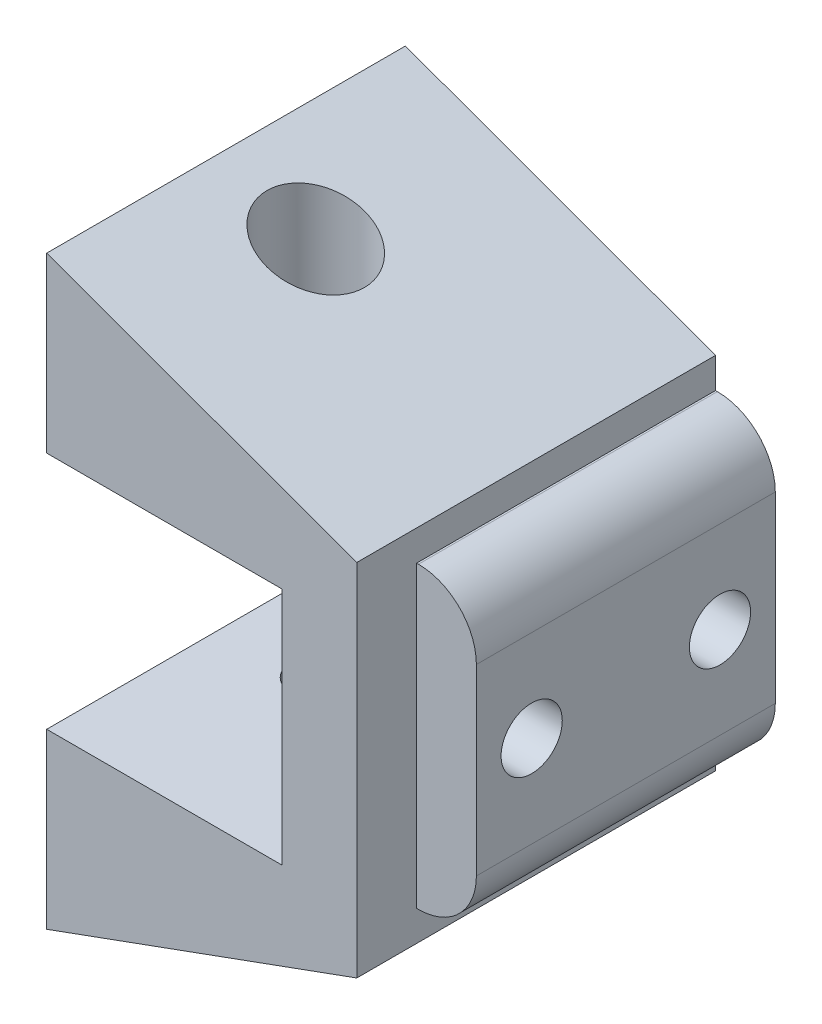
ISO-10303-21;
HEADER;
FILE_DESCRIPTION(('STEP AP214'),'2;1');
FILE_NAME('part.step','',(''),(''),'','','');
FILE_SCHEMA(('AUTOMOTIVE_DESIGN { 1 0 10303 214 1 1 1 1 }'));
ENDSEC;
DATA;
#1=APPLICATION_CONTEXT('core data for automotive mechanical design processes');
#2=APPLICATION_PROTOCOL_DEFINITION('international standard','automotive_design',2000,#1);
#3=PRODUCT_CONTEXT('',#1,'mechanical');
#4=PRODUCT('Part','Part','',(#3));
#5=PRODUCT_RELATED_PRODUCT_CATEGORY('part','',(#4));
#6=PRODUCT_DEFINITION_FORMATION('','',#4);
#7=PRODUCT_DEFINITION_CONTEXT('part definition',#1,'design');
#8=PRODUCT_DEFINITION('design','',#6,#7);
#9=PRODUCT_DEFINITION_SHAPE('','',#8);
#10=(LENGTH_UNIT() NAMED_UNIT(*) SI_UNIT(.MILLI.,.METRE.));
#11=(NAMED_UNIT(*) PLANE_ANGLE_UNIT() SI_UNIT($,.RADIAN.));
#12=(NAMED_UNIT(*) SI_UNIT($,.STERADIAN.) SOLID_ANGLE_UNIT());
#13=UNCERTAINTY_MEASURE_WITH_UNIT(LENGTH_MEASURE(1.E-05),#10,'distance_accuracy_value','');
#14=(GEOMETRIC_REPRESENTATION_CONTEXT(3) GLOBAL_UNCERTAINTY_ASSIGNED_CONTEXT((#13)) GLOBAL_UNIT_ASSIGNED_CONTEXT((#10,
#11,#12)) REPRESENTATION_CONTEXT('',''));
#15=CARTESIAN_POINT('',(0.,0.,0.));
#16=DIRECTION('',(0.,0.,1.));
#17=DIRECTION('',(1.,0.,0.));
#18=AXIS2_PLACEMENT_3D('',#15,#16,#17);
#19=CARTESIAN_POINT('',(0.,0.,0.));
#20=DIRECTION('',(1.,0.,0.));
#21=DIRECTION('',(0.,0.,-1.));
#22=AXIS2_PLACEMENT_3D('',#19,#20,#21);
#23=PLANE('',#22);
#24=CARTESIAN_POINT('',(0.,0.,4.701));
#25=DIRECTION('',(1.,0.,0.));
#26=DIRECTION('',(0.,0.,-1.));
#27=AXIS2_PLACEMENT_3D('',#24,#25,#26);
#28=CIRCLE('',#27,2.6);
#29=CARTESIAN_POINT('',(0.,0.,2.101));
#30=VERTEX_POINT('',#29);
#31=EDGE_CURVE('E54',#30,#30,#28,.T.);
#32=ORIENTED_EDGE('',*,*,#31,.T.);
#33=EDGE_LOOP('',(#32));
#34=FACE_BOUND('',#33,.T.);
#35=CARTESIAN_POINT('',(0.,0.,20.701));
#36=DIRECTION('',(1.,0.,0.));
#37=DIRECTION('',(0.,0.,-1.));
#38=AXIS2_PLACEMENT_3D('',#35,#36,#37);
#39=CIRCLE('',#38,2.6);
#40=CARTESIAN_POINT('',(0.,0.,18.101));
#41=VERTEX_POINT('',#40);
#42=EDGE_CURVE('E333',#41,#41,#39,.T.);
#43=ORIENTED_EDGE('',*,*,#42,.T.);
#44=EDGE_LOOP('',(#43));
#45=FACE_BOUND('',#44,.T.);
#46=DIRECTION('',(0.,0.,1.));
#47=VECTOR('',#46,1.);
#48=CARTESIAN_POINT('',(0.,10.16,30.48));
#49=LINE('',#48,#47);
#50=CARTESIAN_POINT('',(0.,10.16,0.));
#51=VERTEX_POINT('',#50);
#52=CARTESIAN_POINT('',(0.,10.16,30.48));
#53=VERTEX_POINT('',#52);
#54=EDGE_CURVE('E218',#51,#53,#49,.T.);
#55=ORIENTED_EDGE('',*,*,#54,.F.);
#56=DIRECTION('',(0.,1.,0.));
#57=VECTOR('',#56,1.);
#58=CARTESIAN_POINT('',(0.,-25.4,0.));
#59=LINE('',#58,#57);
#60=CARTESIAN_POINT('',(0.,-10.16,0.));
#61=VERTEX_POINT('',#60);
#62=EDGE_CURVE('E237',#61,#51,#59,.T.);
#63=ORIENTED_EDGE('',*,*,#62,.F.);
#64=DIRECTION('',(0.,0.,-1.));
#65=VECTOR('',#64,1.);
#66=CARTESIAN_POINT('',(0.,-10.16,30.48));
#67=LINE('',#66,#65);
#68=CARTESIAN_POINT('',(0.,-10.16,30.48));
#69=VERTEX_POINT('',#68);
#70=EDGE_CURVE('E233',#69,#61,#67,.T.);
#71=ORIENTED_EDGE('',*,*,#70,.F.);
#72=DIRECTION('',(0.,-1.,0.));
#73=VECTOR('',#72,1.);
#74=CARTESIAN_POINT('',(0.,-25.4,30.48));
#75=LINE('',#74,#73);
#76=EDGE_CURVE('E275',#53,#69,#75,.T.);
#77=ORIENTED_EDGE('',*,*,#76,.F.);
#78=EDGE_LOOP('',(#55,#63,#71,#77));
#79=FACE_BOUND('',#78,.T.);
#80=ADVANCED_FACE('F51',(#34,#45,#79),#23,.F.);
#81=CARTESIAN_POINT('',(6.35,-25.4,0.));
#82=DIRECTION('',(0.,0.,1.));
#83=DIRECTION('',(1.,0.,0.));
#84=AXIS2_PLACEMENT_3D('',#81,#82,#83);
#85=PLANE('',#84);
#86=DIRECTION('',(-1.,0.,0.));
#87=VECTOR('',#86,1.);
#88=CARTESIAN_POINT('',(11.43,12.7,0.));
#89=LINE('',#88,#87);
#90=CARTESIAN_POINT('',(6.51,12.7,0.));
#91=VERTEX_POINT('',#90);
#92=CARTESIAN_POINT('',(6.35,12.7,0.));
#93=VERTEX_POINT('',#92);
#94=EDGE_CURVE('E161',#91,#93,#89,.T.);
#95=ORIENTED_EDGE('',*,*,#94,.F.);
#96=CARTESIAN_POINT('',(6.51,7.78,0.));
#97=DIRECTION('',(0.,0.,1.));
#98=DIRECTION('',(1.,0.,0.));
#99=AXIS2_PLACEMENT_3D('',#96,#97,#98);
#100=CIRCLE('',#99,4.92);
#101=CARTESIAN_POINT('',(11.43,7.78,0.));
#102=VERTEX_POINT('',#101);
#103=EDGE_CURVE('E63',#91,#102,#100,.F.);
#104=ORIENTED_EDGE('',*,*,#103,.T.);
#105=DIRECTION('',(0.,1.,0.));
#106=VECTOR('',#105,1.);
#107=CARTESIAN_POINT('',(11.43,-12.7,0.));
#108=LINE('',#107,#106);
#109=CARTESIAN_POINT('',(11.43,-7.78,0.));
#110=VERTEX_POINT('',#109);
#111=EDGE_CURVE('E180',#110,#102,#108,.T.);
#112=ORIENTED_EDGE('',*,*,#111,.F.);
#113=CARTESIAN_POINT('',(6.51,-7.78,0.));
#114=DIRECTION('',(0.,0.,1.));
#115=DIRECTION('',(1.,0.,0.));
#116=AXIS2_PLACEMENT_3D('',#113,#114,#115);
#117=CIRCLE('',#116,4.92);
#118=CARTESIAN_POINT('',(6.51,-12.7,0.));
#119=VERTEX_POINT('',#118);
#120=EDGE_CURVE('E66',#110,#119,#117,.F.);
#121=ORIENTED_EDGE('',*,*,#120,.T.);
#122=DIRECTION('',(-1.,0.,0.));
#123=VECTOR('',#122,1.);
#124=CARTESIAN_POINT('',(11.43,-12.7,0.));
#125=LINE('',#124,#123);
#126=CARTESIAN_POINT('',(6.35,-12.7,0.));
#127=VERTEX_POINT('',#126);
#128=EDGE_CURVE('E194',#119,#127,#125,.T.);
#129=ORIENTED_EDGE('',*,*,#128,.T.);
#130=DIRECTION('',(0.,1.,0.));
#131=VECTOR('',#130,1.);
#132=CARTESIAN_POINT('',(6.35,-25.4,0.));
#133=LINE('',#132,#131);
#134=CARTESIAN_POINT('',(6.35,-15.2889068920846,0.));
#135=VERTEX_POINT('',#134);
#136=EDGE_CURVE('E256',#135,#127,#133,.T.);
#137=ORIENTED_EDGE('',*,*,#136,.F.);
#138=DIRECTION('',(-0.939692620785906,-0.342020143325676,0.));
#139=VECTOR('',#138,1.);
#140=CARTESIAN_POINT('',(6.35,-15.2889068920846,0.));
#141=LINE('',#140,#139);
#142=CARTESIAN_POINT('',(-20.,-24.8795225649993,0.));
#143=VERTEX_POINT('',#142);
#144=EDGE_CURVE('E296',#135,#143,#141,.T.);
#145=ORIENTED_EDGE('',*,*,#144,.T.);
#146=DIRECTION('',(0.,-1.,0.));
#147=VECTOR('',#146,1.);
#148=CARTESIAN_POINT('',(-20.,-25.4,0.));
#149=LINE('',#148,#147);
#150=CARTESIAN_POINT('',(-20.,-10.16,0.));
#151=VERTEX_POINT('',#150);
#152=EDGE_CURVE('E250',#151,#143,#149,.T.);
#153=ORIENTED_EDGE('',*,*,#152,.F.);
#154=DIRECTION('',(1.,0.,0.));
#155=VECTOR('',#154,1.);
#156=CARTESIAN_POINT('',(-20.,-10.16,0.));
#157=LINE('',#156,#155);
#158=EDGE_CURVE('E243',#151,#61,#157,.T.);
#159=ORIENTED_EDGE('',*,*,#158,.T.);
#160=ORIENTED_EDGE('',*,*,#62,.T.);
#161=DIRECTION('',(1.,0.,0.));
#162=VECTOR('',#161,1.);
#163=CARTESIAN_POINT('',(-20.,10.16,0.));
#164=LINE('',#163,#162);
#165=CARTESIAN_POINT('',(-20.,10.16,0.));
#166=VERTEX_POINT('',#165);
#167=EDGE_CURVE('E232',#166,#51,#164,.T.);
#168=ORIENTED_EDGE('',*,*,#167,.F.);
#169=DIRECTION('',(0.,-1.,0.));
#170=VECTOR('',#169,1.);
#171=CARTESIAN_POINT('',(-20.,25.4,0.));
#172=LINE('',#171,#170);
#173=CARTESIAN_POINT('',(-20.,24.8795225649993,0.));
#174=VERTEX_POINT('',#173);
#175=EDGE_CURVE('E217',#174,#166,#172,.T.);
#176=ORIENTED_EDGE('',*,*,#175,.F.);
#177=DIRECTION('',(0.939692620785906,-0.342020143325676,0.));
#178=VECTOR('',#177,1.);
#179=CARTESIAN_POINT('',(6.35,15.2889068920846,0.));
#180=LINE('',#179,#178);
#181=CARTESIAN_POINT('',(6.35,15.2889068920846,0.));
#182=VERTEX_POINT('',#181);
#183=EDGE_CURVE('E301',#174,#182,#180,.T.);
#184=ORIENTED_EDGE('',*,*,#183,.T.);
#185=EDGE_CURVE('E261',#93,#182,#133,.T.);
#186=ORIENTED_EDGE('',*,*,#185,.F.);
#187=EDGE_LOOP('',(#95,#104,#112,#121,#129,#137,#145,#153,#159,#160,#168,#176,#184,#186));
#188=FACE_BOUND('',#187,.T.);
#189=ADVANCED_FACE('F363',(#188),#85,.F.);
#190=CARTESIAN_POINT('',(6.35,-25.4,30.48));
#191=DIRECTION('',(0.,0.,-1.));
#192=DIRECTION('',(-1.,0.,0.));
#193=AXIS2_PLACEMENT_3D('',#190,#191,#192);
#194=PLANE('',#193);
#195=DIRECTION('',(0.,-1.,0.));
#196=VECTOR('',#195,1.);
#197=CARTESIAN_POINT('',(6.35,-25.4,30.48));
#198=LINE('',#197,#196);
#199=CARTESIAN_POINT('',(6.35,15.2889068920846,30.48));
#200=VERTEX_POINT('',#199);
#201=CARTESIAN_POINT('',(6.35,-15.2889068920846,30.48));
#202=VERTEX_POINT('',#201);
#203=EDGE_CURVE('E264',#200,#202,#198,.T.);
#204=ORIENTED_EDGE('',*,*,#203,.F.);
#205=DIRECTION('',(-0.939692620785906,0.342020143325676,0.));
#206=VECTOR('',#205,1.);
#207=CARTESIAN_POINT('',(6.35,15.2889068920846,30.48));
#208=LINE('',#207,#206);
#209=CARTESIAN_POINT('',(-20.,24.8795225649993,30.48));
#210=VERTEX_POINT('',#209);
#211=EDGE_CURVE('E292',#200,#210,#208,.T.);
#212=ORIENTED_EDGE('',*,*,#211,.T.);
#213=DIRECTION('',(0.,1.,0.));
#214=VECTOR('',#213,1.);
#215=CARTESIAN_POINT('',(-20.,25.4,30.48));
#216=LINE('',#215,#214);
#217=CARTESIAN_POINT('',(-20.,10.16,30.48));
#218=VERTEX_POINT('',#217);
#219=EDGE_CURVE('E222',#218,#210,#216,.T.);
#220=ORIENTED_EDGE('',*,*,#219,.F.);
#221=DIRECTION('',(1.,0.,0.));
#222=VECTOR('',#221,1.);
#223=CARTESIAN_POINT('',(-20.,10.16,30.48));
#224=LINE('',#223,#222);
#225=EDGE_CURVE('E227',#218,#53,#224,.T.);
#226=ORIENTED_EDGE('',*,*,#225,.T.);
#227=ORIENTED_EDGE('',*,*,#76,.T.);
#228=DIRECTION('',(1.,0.,0.));
#229=VECTOR('',#228,1.);
#230=CARTESIAN_POINT('',(-20.,-10.16,30.48));
#231=LINE('',#230,#229);
#232=CARTESIAN_POINT('',(-20.,-10.16,30.48));
#233=VERTEX_POINT('',#232);
#234=EDGE_CURVE('E215',#233,#69,#231,.T.);
#235=ORIENTED_EDGE('',*,*,#234,.F.);
#236=DIRECTION('',(0.,1.,0.));
#237=VECTOR('',#236,1.);
#238=CARTESIAN_POINT('',(-20.,-25.4,30.48));
#239=LINE('',#238,#237);
#240=CARTESIAN_POINT('',(-20.,-24.8795225649993,30.48));
#241=VERTEX_POINT('',#240);
#242=EDGE_CURVE('E252',#241,#233,#239,.T.);
#243=ORIENTED_EDGE('',*,*,#242,.F.);
#244=DIRECTION('',(0.939692620785906,0.342020143325676,0.));
#245=VECTOR('',#244,1.);
#246=CARTESIAN_POINT('',(6.35,-15.2889068920846,30.48));
#247=LINE('',#246,#245);
#248=EDGE_CURVE('E290',#241,#202,#247,.T.);
#249=ORIENTED_EDGE('',*,*,#248,.T.);
#250=EDGE_LOOP('',(#204,#212,#220,#226,#227,#235,#243,#249));
#251=FACE_BOUND('',#250,.T.);
#252=ADVANCED_FACE('F366',(#251),#194,.F.);
#253=CARTESIAN_POINT('',(6.35,0.,0.));
#254=DIRECTION('',(1.,0.,0.));
#255=DIRECTION('',(0.,0.,-1.));
#256=AXIS2_PLACEMENT_3D('',#253,#254,#255);
#257=PLANE('',#256);
#258=ORIENTED_EDGE('',*,*,#185,.T.);
#259=DIRECTION('',(0.,0.,1.));
#260=VECTOR('',#259,1.);
#261=CARTESIAN_POINT('',(6.35,15.2889068920846,30.48));
#262=LINE('',#261,#260);
#263=EDGE_CURVE('E283',#182,#200,#262,.T.);
#264=ORIENTED_EDGE('',*,*,#263,.T.);
#265=ORIENTED_EDGE('',*,*,#203,.T.);
#266=DIRECTION('',(0.,0.,-1.));
#267=VECTOR('',#266,1.);
#268=CARTESIAN_POINT('',(6.35,-15.2889068920846,0.));
#269=LINE('',#268,#267);
#270=EDGE_CURVE('E267',#202,#135,#269,.T.);
#271=ORIENTED_EDGE('',*,*,#270,.T.);
#272=ORIENTED_EDGE('',*,*,#136,.T.);
#273=DIRECTION('',(0.,0.,-1.));
#274=VECTOR('',#273,1.);
#275=CARTESIAN_POINT('',(6.35,-12.7,0.));
#276=LINE('',#275,#274);
#277=CARTESIAN_POINT('',(6.35,-12.7,25.4));
#278=VERTEX_POINT('',#277);
#279=EDGE_CURVE('E174',#278,#127,#276,.T.);
#280=ORIENTED_EDGE('',*,*,#279,.F.);
#281=DIRECTION('',(0.,-1.,0.));
#282=VECTOR('',#281,1.);
#283=CARTESIAN_POINT('',(6.35,-12.7,25.4));
#284=LINE('',#283,#282);
#285=CARTESIAN_POINT('',(6.35,12.7,25.4));
#286=VERTEX_POINT('',#285);
#287=EDGE_CURVE('E160',#286,#278,#284,.T.);
#288=ORIENTED_EDGE('',*,*,#287,.F.);
#289=DIRECTION('',(0.,0.,1.));
#290=VECTOR('',#289,1.);
#291=CARTESIAN_POINT('',(6.35,12.7,0.));
#292=LINE('',#291,#290);
#293=EDGE_CURVE('E171',#93,#286,#292,.T.);
#294=ORIENTED_EDGE('',*,*,#293,.F.);
#295=EDGE_LOOP('',(#258,#264,#265,#271,#272,#280,#288,#294));
#296=FACE_BOUND('',#295,.T.);
#297=ADVANCED_FACE('F167',(#296),#257,.T.);
#298=CARTESIAN_POINT('',(-20.,-10.16,30.48));
#299=DIRECTION('',(0.,-1.,0.));
#300=DIRECTION('',(0.,0.,-1.));
#301=AXIS2_PLACEMENT_3D('',#298,#299,#300);
#302=PLANE('',#301);
#303=CARTESIAN_POINT('',(-12.38,-10.16,15.24));
#304=DIRECTION('',(0.,-1.,0.));
#305=DIRECTION('',(0.,0.,-1.));
#306=AXIS2_PLACEMENT_3D('',#303,#304,#305);
#307=CIRCLE('',#306,2.135);
#308=CARTESIAN_POINT('',(-12.38,-10.16,13.105));
#309=VERTEX_POINT('',#308);
#310=EDGE_CURVE('E196',#309,#309,#307,.T.);
#311=ORIENTED_EDGE('',*,*,#310,.T.);
#312=EDGE_LOOP('',(#311));
#313=FACE_BOUND('',#312,.T.);
#314=ORIENTED_EDGE('',*,*,#70,.T.);
#315=ORIENTED_EDGE('',*,*,#158,.F.);
#316=DIRECTION('',(0.,0.,-1.));
#317=VECTOR('',#316,1.);
#318=CARTESIAN_POINT('',(-20.,-10.16,30.48));
#319=LINE('',#318,#317);
#320=EDGE_CURVE('E253',#233,#151,#319,.T.);
#321=ORIENTED_EDGE('',*,*,#320,.F.);
#322=ORIENTED_EDGE('',*,*,#234,.T.);
#323=EDGE_LOOP('',(#314,#315,#321,#322));
#324=FACE_BOUND('',#323,.T.);
#325=ADVANCED_FACE('F454',(#313,#324),#302,.F.);
#326=CARTESIAN_POINT('',(-20.,0.,0.));
#327=DIRECTION('',(1.,0.,0.));
#328=DIRECTION('',(0.,0.,-1.));
#329=AXIS2_PLACEMENT_3D('',#326,#327,#328);
#330=PLANE('',#329);
#331=ORIENTED_EDGE('',*,*,#152,.T.);
#332=DIRECTION('',(0.,0.,1.));
#333=VECTOR('',#332,1.);
#334=CARTESIAN_POINT('',(-20.,-24.8795225649993,0.));
#335=LINE('',#334,#333);
#336=EDGE_CURVE('E302',#143,#241,#335,.T.);
#337=ORIENTED_EDGE('',*,*,#336,.T.);
#338=ORIENTED_EDGE('',*,*,#242,.T.);
#339=ORIENTED_EDGE('',*,*,#320,.T.);
#340=EDGE_LOOP('',(#331,#337,#338,#339));
#341=FACE_BOUND('',#340,.T.);
#342=ADVANCED_FACE('F448',(#341),#330,.F.);
#343=CARTESIAN_POINT('',(-20.,10.16,30.48));
#344=DIRECTION('',(0.,1.,0.));
#345=DIRECTION('',(0.,0.,1.));
#346=AXIS2_PLACEMENT_3D('',#343,#344,#345);
#347=PLANE('',#346);
#348=CARTESIAN_POINT('',(-12.38,10.16,15.24));
#349=DIRECTION('',(0.,1.,0.));
#350=DIRECTION('',(0.,0.,1.));
#351=AXIS2_PLACEMENT_3D('',#348,#349,#350);
#352=CIRCLE('',#351,2.35);
#353=CARTESIAN_POINT('',(-12.38,10.16,17.59));
#354=VERTEX_POINT('',#353);
#355=EDGE_CURVE('E209',#354,#354,#352,.T.);
#356=ORIENTED_EDGE('',*,*,#355,.T.);
#357=EDGE_LOOP('',(#356));
#358=FACE_BOUND('',#357,.T.);
#359=ORIENTED_EDGE('',*,*,#54,.T.);
#360=ORIENTED_EDGE('',*,*,#225,.F.);
#361=DIRECTION('',(0.,0.,1.));
#362=VECTOR('',#361,1.);
#363=CARTESIAN_POINT('',(-20.,10.16,30.48));
#364=LINE('',#363,#362);
#365=EDGE_CURVE('E216',#166,#218,#364,.T.);
#366=ORIENTED_EDGE('',*,*,#365,.F.);
#367=ORIENTED_EDGE('',*,*,#167,.T.);
#368=EDGE_LOOP('',(#359,#360,#366,#367));
#369=FACE_BOUND('',#368,.T.);
#370=ADVANCED_FACE('F447',(#358,#369),#347,.F.);
#371=CARTESIAN_POINT('',(-20.,0.,0.));
#372=DIRECTION('',(-1.,0.,0.));
#373=DIRECTION('',(0.,0.,1.));
#374=AXIS2_PLACEMENT_3D('',#371,#372,#373);
#375=PLANE('',#374);
#376=ORIENTED_EDGE('',*,*,#219,.T.);
#377=DIRECTION('',(0.,0.,-1.));
#378=VECTOR('',#377,1.);
#379=CARTESIAN_POINT('',(-20.,24.8795225649993,0.));
#380=LINE('',#379,#378);
#381=EDGE_CURVE('E294',#210,#174,#380,.T.);
#382=ORIENTED_EDGE('',*,*,#381,.T.);
#383=ORIENTED_EDGE('',*,*,#175,.T.);
#384=ORIENTED_EDGE('',*,*,#365,.T.);
#385=EDGE_LOOP('',(#376,#382,#383,#384));
#386=FACE_BOUND('',#385,.T.);
#387=ADVANCED_FACE('F445',(#386),#375,.T.);
#388=CARTESIAN_POINT('',(-12.38,14.732,15.24));
#389=DIRECTION('',(0.,1.,0.));
#390=DIRECTION('',(0.,0.,1.));
#391=AXIS2_PLACEMENT_3D('',#388,#389,#390);
#392=CYLINDRICAL_SURFACE('',#391,4.135);
#393=CARTESIAN_POINT('',(-12.38,14.732,15.24));
#394=DIRECTION('',(0.,1.,0.));
#395=DIRECTION('',(0.,0.,1.));
#396=AXIS2_PLACEMENT_3D('',#393,#394,#395);
#397=CIRCLE('',#396,4.135);
#398=CARTESIAN_POINT('',(-12.38,14.732,19.375));
#399=VERTEX_POINT('',#398);
#400=EDGE_CURVE('E208',#399,#399,#397,.T.);
#401=ORIENTED_EDGE('',*,*,#400,.F.);
#402=EDGE_LOOP('',(#401));
#403=FACE_BOUND('',#402,.T.);
#404=CARTESIAN_POINT('',(-12.38,22.1060693798907,15.24));
#405=DIRECTION('',(0.342020143325676,0.939692620785906,0.));
#406=DIRECTION('',(-0.939692620785906,0.342020143325676,0.));
#407=AXIS2_PLACEMENT_3D('',#404,#405,#406);
#408=ELLIPSE('',#407,4.4003750891879,4.135);
#409=CARTESIAN_POINT('',(-16.515,23.6110862985815,15.24));
#410=VERTEX_POINT('',#409);
#411=EDGE_CURVE('E211',#410,#410,#408,.T.);
#412=ORIENTED_EDGE('',*,*,#411,.T.);
#413=EDGE_LOOP('',(#412));
#414=FACE_BOUND('',#413,.T.);
#415=ADVANCED_FACE('F438',(#403,#414),#392,.F.);
#416=CARTESIAN_POINT('',(-12.38,14.732,15.24));
#417=DIRECTION('',(0.,1.,0.));
#418=DIRECTION('',(0.,0.,1.));
#419=AXIS2_PLACEMENT_3D('',#416,#417,#418);
#420=PLANE('',#419);
#421=CARTESIAN_POINT('',(-12.38,14.732,15.24));
#422=DIRECTION('',(0.,1.,0.));
#423=DIRECTION('',(0.,0.,1.));
#424=AXIS2_PLACEMENT_3D('',#421,#422,#423);
#425=CIRCLE('',#424,2.35);
#426=CARTESIAN_POINT('',(-12.38,14.732,17.59));
#427=VERTEX_POINT('',#426);
#428=EDGE_CURVE('E205',#427,#427,#425,.T.);
#429=ORIENTED_EDGE('',*,*,#428,.F.);
#430=EDGE_LOOP('',(#429));
#431=FACE_BOUND('',#430,.T.);
#432=ORIENTED_EDGE('',*,*,#400,.T.);
#433=EDGE_LOOP('',(#432));
#434=FACE_BOUND('',#433,.T.);
#435=ADVANCED_FACE('F432',(#431,#434),#420,.T.);
#436=CARTESIAN_POINT('',(-12.38,6.73199999999998,15.24));
#437=DIRECTION('',(0.,1.,0.));
#438=DIRECTION('',(0.,0.,1.));
#439=AXIS2_PLACEMENT_3D('',#436,#437,#438);
#440=CYLINDRICAL_SURFACE('',#439,2.35);
#441=ORIENTED_EDGE('',*,*,#428,.T.);
#442=EDGE_LOOP('',(#441));
#443=FACE_BOUND('',#442,.T.);
#444=ORIENTED_EDGE('',*,*,#355,.F.);
#445=EDGE_LOOP('',(#444));
#446=FACE_BOUND('',#445,.T.);
#447=ADVANCED_FACE('F427',(#443,#446),#440,.F.);
#448=CARTESIAN_POINT('',(-12.38,-14.732,15.24));
#449=DIRECTION('',(0.,-1.,0.));
#450=DIRECTION('',(0.,0.,-1.));
#451=AXIS2_PLACEMENT_3D('',#448,#449,#450);
#452=CYLINDRICAL_SURFACE('',#451,4.135);
#453=CARTESIAN_POINT('',(-12.38,-14.732,15.24));
#454=DIRECTION('',(0.,-1.,0.));
#455=DIRECTION('',(0.,0.,-1.));
#456=AXIS2_PLACEMENT_3D('',#453,#454,#455);
#457=CIRCLE('',#456,4.135);
#458=CARTESIAN_POINT('',(-12.38,-14.732,11.105));
#459=VERTEX_POINT('',#458);
#460=EDGE_CURVE('E198',#459,#459,#457,.T.);
#461=ORIENTED_EDGE('',*,*,#460,.F.);
#462=EDGE_LOOP('',(#461));
#463=FACE_BOUND('',#462,.T.);
#464=CARTESIAN_POINT('',(-12.38,-22.1060693798907,15.24));
#465=DIRECTION('',(0.342020143325676,-0.939692620785906,0.));
#466=DIRECTION('',(-0.939692620785906,-0.342020143325676,0.));
#467=AXIS2_PLACEMENT_3D('',#464,#465,#466);
#468=ELLIPSE('',#467,4.40037508918791,4.135);
#469=CARTESIAN_POINT('',(-16.515,-23.6110862985815,15.24));
#470=VERTEX_POINT('',#469);
#471=EDGE_CURVE('E201',#470,#470,#468,.T.);
#472=ORIENTED_EDGE('',*,*,#471,.T.);
#473=EDGE_LOOP('',(#472));
#474=FACE_BOUND('',#473,.T.);
#475=ADVANCED_FACE('F428',(#463,#474),#452,.F.);
#476=CARTESIAN_POINT('',(-12.38,-14.732,15.24));
#477=DIRECTION('',(0.,-1.,0.));
#478=DIRECTION('',(0.,0.,-1.));
#479=AXIS2_PLACEMENT_3D('',#476,#477,#478);
#480=PLANE('',#479);
#481=CARTESIAN_POINT('',(-12.38,-14.732,15.24));
#482=DIRECTION('',(0.,-1.,0.));
#483=DIRECTION('',(0.,0.,-1.));
#484=AXIS2_PLACEMENT_3D('',#481,#482,#483);
#485=CIRCLE('',#484,2.135);
#486=CARTESIAN_POINT('',(-12.38,-14.732,13.105));
#487=VERTEX_POINT('',#486);
#488=EDGE_CURVE('E191',#487,#487,#485,.T.);
#489=ORIENTED_EDGE('',*,*,#488,.F.);
#490=EDGE_LOOP('',(#489));
#491=FACE_BOUND('',#490,.T.);
#492=ORIENTED_EDGE('',*,*,#460,.T.);
#493=EDGE_LOOP('',(#492));
#494=FACE_BOUND('',#493,.T.);
#495=ADVANCED_FACE('F419',(#491,#494),#480,.T.);
#496=CARTESIAN_POINT('',(-12.38,-6.73199999999998,15.24));
#497=DIRECTION('',(0.,-1.,0.));
#498=DIRECTION('',(0.,0.,-1.));
#499=AXIS2_PLACEMENT_3D('',#496,#497,#498);
#500=CYLINDRICAL_SURFACE('',#499,2.135);
#501=ORIENTED_EDGE('',*,*,#488,.T.);
#502=EDGE_LOOP('',(#501));
#503=FACE_BOUND('',#502,.T.);
#504=ORIENTED_EDGE('',*,*,#310,.F.);
#505=EDGE_LOOP('',(#504));
#506=FACE_BOUND('',#505,.T.);
#507=ADVANCED_FACE('F410',(#503,#506),#500,.F.);
#508=CARTESIAN_POINT('',(11.43,0.,0.));
#509=DIRECTION('',(-1.,0.,0.));
#510=DIRECTION('',(0.,0.,1.));
#511=AXIS2_PLACEMENT_3D('',#508,#509,#510);
#512=PLANE('',#511);
#513=ORIENTED_EDGE('',*,*,#111,.T.);
#514=DIRECTION('',(0.,0.,1.));
#515=VECTOR('',#514,1.);
#516=CARTESIAN_POINT('',(11.43,7.78,0.));
#517=LINE('',#516,#515);
#518=CARTESIAN_POINT('',(11.43,7.77999999999999,25.4));
#519=VERTEX_POINT('',#518);
#520=EDGE_CURVE('E320',#102,#519,#517,.T.);
#521=ORIENTED_EDGE('',*,*,#520,.T.);
#522=DIRECTION('',(0.,-1.,0.));
#523=VECTOR('',#522,1.);
#524=CARTESIAN_POINT('',(11.43,-12.7,25.4));
#525=LINE('',#524,#523);
#526=CARTESIAN_POINT('',(11.43,-7.78,25.4));
#527=VERTEX_POINT('',#526);
#528=EDGE_CURVE('E189',#519,#527,#525,.T.);
#529=ORIENTED_EDGE('',*,*,#528,.T.);
#530=DIRECTION('',(0.,0.,-1.));
#531=VECTOR('',#530,1.);
#532=CARTESIAN_POINT('',(11.43,-7.78,0.));
#533=LINE('',#532,#531);
#534=EDGE_CURVE('E310',#527,#110,#533,.T.);
#535=ORIENTED_EDGE('',*,*,#534,.T.);
#536=EDGE_LOOP('',(#513,#521,#529,#535));
#537=FACE_BOUND('',#536,.T.);
#538=CARTESIAN_POINT('',(11.43,0.,20.701));
#539=DIRECTION('',(1.,0.,0.));
#540=DIRECTION('',(0.,0.,-1.));
#541=AXIS2_PLACEMENT_3D('',#538,#539,#540);
#542=CIRCLE('',#541,2.6);
#543=CARTESIAN_POINT('',(11.43,0.,18.101));
#544=VERTEX_POINT('',#543);
#545=EDGE_CURVE('E182',#544,#544,#542,.T.);
#546=ORIENTED_EDGE('',*,*,#545,.F.);
#547=EDGE_LOOP('',(#546));
#548=FACE_BOUND('',#547,.T.);
#549=CARTESIAN_POINT('',(11.43,0.,4.701));
#550=DIRECTION('',(1.,0.,0.));
#551=DIRECTION('',(0.,0.,-1.));
#552=AXIS2_PLACEMENT_3D('',#549,#550,#551);
#553=CIRCLE('',#552,2.6);
#554=CARTESIAN_POINT('',(11.43,0.,2.101));
#555=VERTEX_POINT('',#554);
#556=EDGE_CURVE('E335',#555,#555,#553,.T.);
#557=ORIENTED_EDGE('',*,*,#556,.F.);
#558=EDGE_LOOP('',(#557));
#559=FACE_BOUND('',#558,.T.);
#560=ADVANCED_FACE('F391',(#537,#548,#559),#512,.F.);
#561=CARTESIAN_POINT('',(11.43,-12.7,0.));
#562=DIRECTION('',(0.,1.,0.));
#563=DIRECTION('',(0.,0.,1.));
#564=AXIS2_PLACEMENT_3D('',#561,#562,#563);
#565=PLANE('',#564);
#566=ORIENTED_EDGE('',*,*,#128,.F.);
#567=DIRECTION('',(0.,0.,-1.));
#568=VECTOR('',#567,1.);
#569=CARTESIAN_POINT('',(6.51,-12.7,0.));
#570=LINE('',#569,#568);
#571=CARTESIAN_POINT('',(6.51,-12.7,25.4));
#572=VERTEX_POINT('',#571);
#573=EDGE_CURVE('E11',#119,#572,#570,.F.);
#574=ORIENTED_EDGE('',*,*,#573,.T.);
#575=DIRECTION('',(-1.,0.,0.));
#576=VECTOR('',#575,1.);
#577=CARTESIAN_POINT('',(11.43,-12.7,25.4));
#578=LINE('',#577,#576);
#579=EDGE_CURVE('E165',#572,#278,#578,.T.);
#580=ORIENTED_EDGE('',*,*,#579,.T.);
#581=ORIENTED_EDGE('',*,*,#279,.T.);
#582=EDGE_LOOP('',(#566,#574,#580,#581));
#583=FACE_BOUND('',#582,.T.);
#584=ADVANCED_FACE('F407',(#583),#565,.F.);
#585=CARTESIAN_POINT('',(11.43,12.7,0.));
#586=DIRECTION('',(0.,-1.,0.));
#587=DIRECTION('',(0.,0.,-1.));
#588=AXIS2_PLACEMENT_3D('',#585,#586,#587);
#589=PLANE('',#588);
#590=DIRECTION('',(-1.,0.,0.));
#591=VECTOR('',#590,1.);
#592=CARTESIAN_POINT('',(11.43,12.7,25.4));
#593=LINE('',#592,#591);
#594=CARTESIAN_POINT('',(6.51,12.7,25.4));
#595=VERTEX_POINT('',#594);
#596=EDGE_CURVE('E151',#595,#286,#593,.T.);
#597=ORIENTED_EDGE('',*,*,#596,.F.);
#598=DIRECTION('',(0.,0.,1.));
#599=VECTOR('',#598,1.);
#600=CARTESIAN_POINT('',(6.51,12.7,0.));
#601=LINE('',#600,#599);
#602=EDGE_CURVE('E80',#595,#91,#601,.F.);
#603=ORIENTED_EDGE('',*,*,#602,.T.);
#604=ORIENTED_EDGE('',*,*,#94,.T.);
#605=ORIENTED_EDGE('',*,*,#293,.T.);
#606=EDGE_LOOP('',(#597,#603,#604,#605));
#607=FACE_BOUND('',#606,.T.);
#608=ADVANCED_FACE('F177',(#607),#589,.F.);
#609=CARTESIAN_POINT('',(11.43,-12.7,25.4));
#610=DIRECTION('',(0.,0.,-1.));
#611=DIRECTION('',(-1.,0.,0.));
#612=AXIS2_PLACEMENT_3D('',#609,#610,#611);
#613=PLANE('',#612);
#614=ORIENTED_EDGE('',*,*,#528,.F.);
#615=CARTESIAN_POINT('',(6.51,7.78,25.4));
#616=DIRECTION('',(0.,0.,-1.));
#617=DIRECTION('',(-1.,0.,0.));
#618=AXIS2_PLACEMENT_3D('',#615,#616,#617);
#619=CIRCLE('',#618,4.92);
#620=EDGE_CURVE('E156',#519,#595,#619,.F.);
#621=ORIENTED_EDGE('',*,*,#620,.T.);
#622=ORIENTED_EDGE('',*,*,#596,.T.);
#623=ORIENTED_EDGE('',*,*,#287,.T.);
#624=ORIENTED_EDGE('',*,*,#579,.F.);
#625=CARTESIAN_POINT('',(6.51,-7.78,25.4));
#626=DIRECTION('',(0.,0.,-1.));
#627=DIRECTION('',(-1.,0.,0.));
#628=AXIS2_PLACEMENT_3D('',#625,#626,#627);
#629=CIRCLE('',#628,4.92);
#630=EDGE_CURVE('E323',#572,#527,#629,.F.);
#631=ORIENTED_EDGE('',*,*,#630,.T.);
#632=EDGE_LOOP('',(#614,#621,#622,#623,#624,#631));
#633=FACE_BOUND('',#632,.T.);
#634=ADVANCED_FACE('F159',(#633),#613,.F.);
#635=CARTESIAN_POINT('',(11.43,0.,20.701));
#636=DIRECTION('',(-1.,0.,0.));
#637=DIRECTION('',(0.,0.,1.));
#638=AXIS2_PLACEMENT_3D('',#635,#636,#637);
#639=CYLINDRICAL_SURFACE('',#638,2.6);
#640=ORIENTED_EDGE('',*,*,#545,.T.);
#641=EDGE_LOOP('',(#640));
#642=FACE_BOUND('',#641,.T.);
#643=ORIENTED_EDGE('',*,*,#42,.F.);
#644=EDGE_LOOP('',(#643));
#645=FACE_BOUND('',#644,.T.);
#646=ADVANCED_FACE('F349',(#642,#645),#639,.F.);
#647=CARTESIAN_POINT('',(11.43,0.,4.701));
#648=DIRECTION('',(-1.,0.,0.));
#649=DIRECTION('',(0.,0.,1.));
#650=AXIS2_PLACEMENT_3D('',#647,#648,#649);
#651=CYLINDRICAL_SURFACE('',#650,2.6);
#652=ORIENTED_EDGE('',*,*,#556,.T.);
#653=EDGE_LOOP('',(#652));
#654=FACE_BOUND('',#653,.T.);
#655=ORIENTED_EDGE('',*,*,#31,.F.);
#656=EDGE_LOOP('',(#655));
#657=FACE_BOUND('',#656,.T.);
#658=ADVANCED_FACE('F341',(#654,#657),#651,.F.);
#659=CARTESIAN_POINT('',(6.35,15.2889068920846,0.));
#660=DIRECTION('',(0.342020143325676,0.939692620785906,0.));
#661=DIRECTION('',(0.,0.,-1.));
#662=AXIS2_PLACEMENT_3D('',#659,#660,#661);
#663=PLANE('',#662);
#664=ORIENTED_EDGE('',*,*,#183,.F.);
#665=ORIENTED_EDGE('',*,*,#381,.F.);
#666=ORIENTED_EDGE('',*,*,#211,.F.);
#667=ORIENTED_EDGE('',*,*,#263,.F.);
#668=EDGE_LOOP('',(#664,#665,#666,#667));
#669=FACE_BOUND('',#668,.T.);
#670=ORIENTED_EDGE('',*,*,#411,.F.);
#671=EDGE_LOOP('',(#670));
#672=FACE_BOUND('',#671,.T.);
#673=ADVANCED_FACE('F350',(#669,#672),#663,.T.);
#674=CARTESIAN_POINT('',(6.35,-15.2889068920846,0.));
#675=DIRECTION('',(0.342020143325676,-0.939692620785906,0.));
#676=DIRECTION('',(0.,0.,1.));
#677=AXIS2_PLACEMENT_3D('',#674,#675,#676);
#678=PLANE('',#677);
#679=ORIENTED_EDGE('',*,*,#248,.F.);
#680=ORIENTED_EDGE('',*,*,#336,.F.);
#681=ORIENTED_EDGE('',*,*,#144,.F.);
#682=ORIENTED_EDGE('',*,*,#270,.F.);
#683=EDGE_LOOP('',(#679,#680,#681,#682));
#684=FACE_BOUND('',#683,.T.);
#685=ORIENTED_EDGE('',*,*,#471,.F.);
#686=EDGE_LOOP('',(#685));
#687=FACE_BOUND('',#686,.T.);
#688=ADVANCED_FACE('F351',(#684,#687),#678,.T.);
#689=CARTESIAN_POINT('',(6.51,7.78,0.));
#690=DIRECTION('',(0.,0.,1.));
#691=DIRECTION('',(0.,-1.,0.));
#692=AXIS2_PLACEMENT_3D('',#689,#690,#691);
#693=CYLINDRICAL_SURFACE('',#692,4.92);
#694=ORIENTED_EDGE('',*,*,#103,.F.);
#695=ORIENTED_EDGE('',*,*,#602,.F.);
#696=ORIENTED_EDGE('',*,*,#620,.F.);
#697=ORIENTED_EDGE('',*,*,#520,.F.);
#698=EDGE_LOOP('',(#694,#695,#696,#697));
#699=FACE_BOUND('',#698,.T.);
#700=ADVANCED_FACE('F382',(#699),#693,.T.);
#701=CARTESIAN_POINT('',(6.51,-7.78,0.));
#702=DIRECTION('',(0.,0.,-1.));
#703=DIRECTION('',(-1.,0.,0.));
#704=AXIS2_PLACEMENT_3D('',#701,#702,#703);
#705=CYLINDRICAL_SURFACE('',#704,4.92);
#706=ORIENTED_EDGE('',*,*,#630,.F.);
#707=ORIENTED_EDGE('',*,*,#573,.F.);
#708=ORIENTED_EDGE('',*,*,#120,.F.);
#709=ORIENTED_EDGE('',*,*,#534,.F.);
#710=EDGE_LOOP('',(#706,#707,#708,#709));
#711=FACE_BOUND('',#710,.T.);
#712=ADVANCED_FACE('F52',(#711),#705,.T.);
#713=CLOSED_SHELL('',(#80,#189,#252,#297,#325,#342,#370,#387,#415,#435,#447,#475,#495,#507,#560,
#584,#608,#634,#646,#658,#673,#688,#700,#712));
#714=MANIFOLD_SOLID_BREP('B2',#713);
#715=ADVANCED_BREP_SHAPE_REPRESENTATION('',(#18,#714),#14);
#716=SHAPE_DEFINITION_REPRESENTATION(#9,#715);
ENDSEC;
END-ISO-10303-21;
